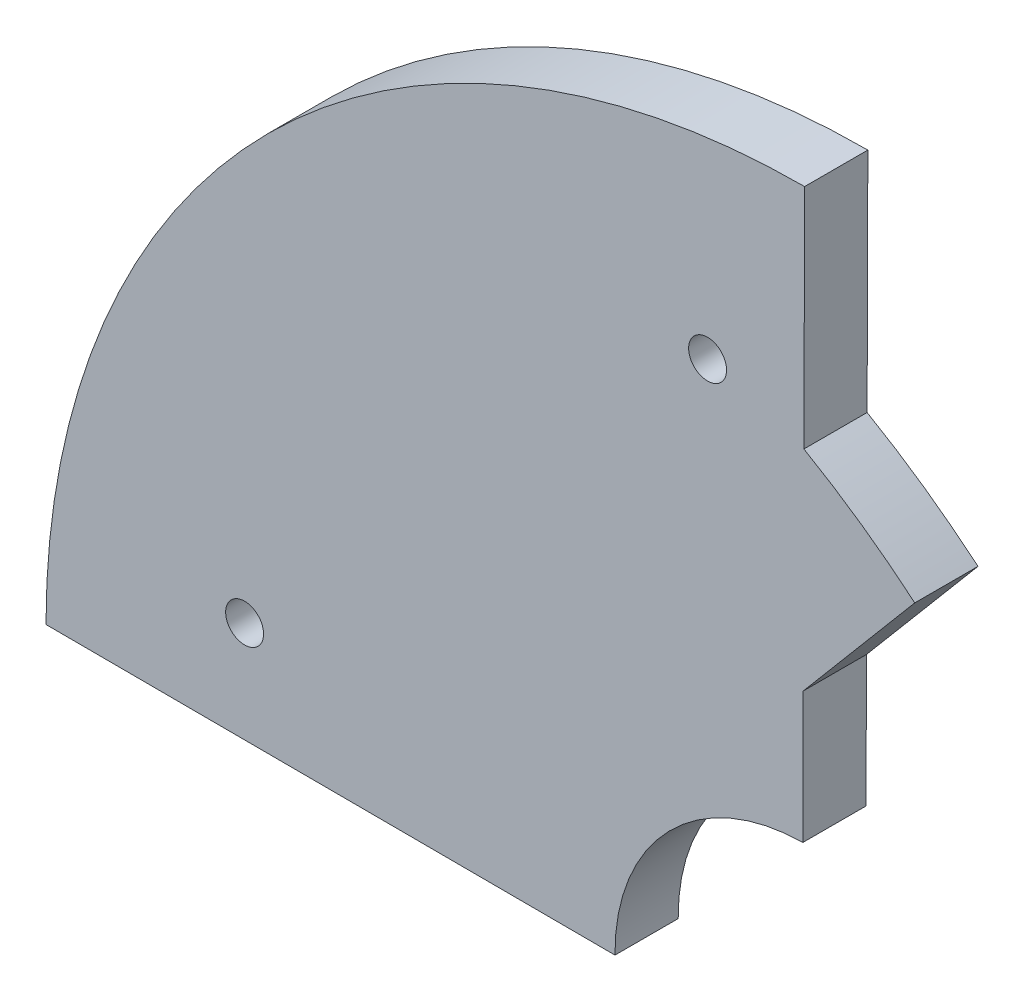
ISO-10303-21;
HEADER;
FILE_DESCRIPTION(('STEP AP214'),'2;1');
FILE_NAME('part.step','',(''),(''),'','','');
FILE_SCHEMA(('AUTOMOTIVE_DESIGN { 1 0 10303 214 1 1 1 1 }'));
ENDSEC;
DATA;
#1=APPLICATION_CONTEXT('core data for automotive mechanical design processes');
#2=APPLICATION_PROTOCOL_DEFINITION('international standard','automotive_design',2000,#1);
#3=PRODUCT_CONTEXT('',#1,'mechanical');
#4=PRODUCT('Part','Part','',(#3));
#5=PRODUCT_RELATED_PRODUCT_CATEGORY('part','',(#4));
#6=PRODUCT_DEFINITION_FORMATION('','',#4);
#7=PRODUCT_DEFINITION_CONTEXT('part definition',#1,'design');
#8=PRODUCT_DEFINITION('design','',#6,#7);
#9=PRODUCT_DEFINITION_SHAPE('','',#8);
#10=(LENGTH_UNIT() NAMED_UNIT(*) SI_UNIT(.MILLI.,.METRE.));
#11=(NAMED_UNIT(*) PLANE_ANGLE_UNIT() SI_UNIT($,.RADIAN.));
#12=(NAMED_UNIT(*) SI_UNIT($,.STERADIAN.) SOLID_ANGLE_UNIT());
#13=UNCERTAINTY_MEASURE_WITH_UNIT(LENGTH_MEASURE(1.E-05),#10,'distance_accuracy_value','');
#14=(GEOMETRIC_REPRESENTATION_CONTEXT(3) GLOBAL_UNCERTAINTY_ASSIGNED_CONTEXT((#13)) GLOBAL_UNIT_ASSIGNED_CONTEXT((#10,
#11,#12)) REPRESENTATION_CONTEXT('',''));
#15=CARTESIAN_POINT('',(0.,0.,0.));
#16=DIRECTION('',(0.,0.,1.));
#17=DIRECTION('',(1.,0.,0.));
#18=AXIS2_PLACEMENT_3D('',#15,#16,#17);
#19=CARTESIAN_POINT('',(-0.142376230836476,14.9993242850768,5.));
#20=DIRECTION('',(-0.999994995004897,0.00316385289736712,0.));
#21=DIRECTION('',(-0.00316385289736712,-0.999994995004897,0.));
#22=AXIS2_PLACEMENT_3D('',#19,#20,#21);
#23=PLANE('',#22);
#24=DIRECTION('',(0.,0.,1.));
#25=VECTOR('',#24,1.);
#26=CARTESIAN_POINT('',(-0.0569674409590416,41.9943727836793,0.));
#27=LINE('',#26,#25);
#28=CARTESIAN_POINT('',(-0.0569674409590416,41.9943727836793,0.));
#29=VERTEX_POINT('',#28);
#30=CARTESIAN_POINT('',(-0.0569674409590287,41.9943727836793,5.));
#31=VERTEX_POINT('',#30);
#32=EDGE_CURVE('E116',#29,#31,#27,.T.);
#33=ORIENTED_EDGE('',*,*,#32,.F.);
#34=DIRECTION('',(0.00316385289736712,0.999994995004897,0.));
#35=VECTOR('',#34,1.);
#36=CARTESIAN_POINT('',(-0.142376230836476,14.9993242850768,0.));
#37=LINE('',#36,#35);
#38=CARTESIAN_POINT('',(0.,60.,0.));
#39=VERTEX_POINT('',#38);
#40=EDGE_CURVE('E105',#29,#39,#37,.T.);
#41=ORIENTED_EDGE('',*,*,#40,.T.);
#42=DIRECTION('',(0.,0.,-1.));
#43=VECTOR('',#42,1.);
#44=CARTESIAN_POINT('',(0.,60.,5.));
#45=LINE('',#44,#43);
#46=CARTESIAN_POINT('',(0.,60.,5.));
#47=VERTEX_POINT('',#46);
#48=EDGE_CURVE('E149',#47,#39,#45,.T.);
#49=ORIENTED_EDGE('',*,*,#48,.F.);
#50=DIRECTION('',(0.00316385289736712,0.999994995004897,0.));
#51=VECTOR('',#50,1.);
#52=CARTESIAN_POINT('',(-0.142376230836476,14.9993242850768,5.));
#53=LINE('',#52,#51);
#54=EDGE_CURVE('E52',#31,#47,#53,.T.);
#55=ORIENTED_EDGE('',*,*,#54,.F.);
#56=EDGE_LOOP('',(#33,#41,#49,#55));
#57=FACE_BOUND('',#56,.T.);
#58=ADVANCED_FACE('F37',(#57),#23,.F.);
#59=DIRECTION('',(0.,0.,1.));
#60=VECTOR('',#59,1.);
#61=CARTESIAN_POINT('',(-0.109488526589845,25.3940994881836,0.));
#62=LINE('',#61,#60);
#63=CARTESIAN_POINT('',(-0.109488526589846,25.3940994881836,0.));
#64=VERTEX_POINT('',#63);
#65=CARTESIAN_POINT('',(-0.109488526589846,25.3940994881836,5.));
#66=VERTEX_POINT('',#65);
#67=EDGE_CURVE('E60',#64,#66,#62,.T.);
#68=ORIENTED_EDGE('',*,*,#67,.T.);
#69=CARTESIAN_POINT('',(-0.142376230836476,14.9993242850768,5.));
#70=VERTEX_POINT('',#69);
#71=EDGE_CURVE('E147',#70,#66,#53,.T.);
#72=ORIENTED_EDGE('',*,*,#71,.F.);
#73=DIRECTION('',(0.,0.,-1.));
#74=VECTOR('',#73,1.);
#75=CARTESIAN_POINT('',(-0.142376230836476,14.9993242850768,5.));
#76=LINE('',#75,#74);
#77=CARTESIAN_POINT('',(-0.142376230836476,14.9993242850768,0.));
#78=VERTEX_POINT('',#77);
#79=EDGE_CURVE('E159',#70,#78,#76,.T.);
#80=ORIENTED_EDGE('',*,*,#79,.T.);
#81=EDGE_CURVE('E143',#78,#64,#37,.T.);
#82=ORIENTED_EDGE('',*,*,#81,.T.);
#83=EDGE_LOOP('',(#68,#72,#80,#82));
#84=FACE_BOUND('',#83,.T.);
#85=ADVANCED_FACE('F169',(#84),#23,.F.);
#86=CARTESIAN_POINT('',(0.,0.,5.));
#87=DIRECTION('',(0.,0.,-1.));
#88=DIRECTION('',(-1.,0.,0.));
#89=AXIS2_PLACEMENT_3D('',#86,#87,#88);
#90=CYLINDRICAL_SURFACE('',#89,60.);
#91=CARTESIAN_POINT('',(0.,0.,0.));
#92=DIRECTION('',(0.,0.,1.));
#93=DIRECTION('',(1.,0.,0.));
#94=AXIS2_PLACEMENT_3D('',#91,#92,#93);
#95=CIRCLE('',#94,60.);
#96=CARTESIAN_POINT('',(-60.,0.,0.));
#97=VERTEX_POINT('',#96);
#98=EDGE_CURVE('E136',#39,#97,#95,.T.);
#99=ORIENTED_EDGE('',*,*,#98,.T.);
#100=DIRECTION('',(0.,0.,-1.));
#101=VECTOR('',#100,1.);
#102=CARTESIAN_POINT('',(-60.,0.,5.));
#103=LINE('',#102,#101);
#104=CARTESIAN_POINT('',(-60.,0.,5.));
#105=VERTEX_POINT('',#104);
#106=EDGE_CURVE('E11',#105,#97,#103,.T.);
#107=ORIENTED_EDGE('',*,*,#106,.F.);
#108=CARTESIAN_POINT('',(0.,0.,5.));
#109=DIRECTION('',(0.,0.,1.));
#110=DIRECTION('',(1.,0.,0.));
#111=AXIS2_PLACEMENT_3D('',#108,#109,#110);
#112=CIRCLE('',#111,60.);
#113=EDGE_CURVE('E139',#47,#105,#112,.T.);
#114=ORIENTED_EDGE('',*,*,#113,.F.);
#115=ORIENTED_EDGE('',*,*,#48,.T.);
#116=EDGE_LOOP('',(#99,#107,#114,#115));
#117=FACE_BOUND('',#116,.T.);
#118=ADVANCED_FACE('F39',(#117),#90,.T.);
#119=CARTESIAN_POINT('',(-60.,0.,5.));
#120=DIRECTION('',(0.0031638528973673,0.999994995004897,0.));
#121=DIRECTION('',(-0.999994995004897,0.0031638528973673,0.));
#122=AXIS2_PLACEMENT_3D('',#119,#120,#121);
#123=PLANE('',#122);
#124=DIRECTION('',(0.999994995004897,-0.0031638528973673,0.));
#125=VECTOR('',#124,1.);
#126=CARTESIAN_POINT('',(-60.,0.,0.));
#127=LINE('',#126,#125);
#128=CARTESIAN_POINT('',(-14.9993242850768,-0.142376230836485,0.));
#129=VERTEX_POINT('',#128);
#130=EDGE_CURVE('E152',#97,#129,#127,.T.);
#131=ORIENTED_EDGE('',*,*,#130,.T.);
#132=DIRECTION('',(0.,0.,-1.));
#133=VECTOR('',#132,1.);
#134=CARTESIAN_POINT('',(-14.9993242850768,-0.142376230836485,5.));
#135=LINE('',#134,#133);
#136=CARTESIAN_POINT('',(-14.9993242850768,-0.142376230836485,5.));
#137=VERTEX_POINT('',#136);
#138=EDGE_CURVE('E45',#137,#129,#135,.T.);
#139=ORIENTED_EDGE('',*,*,#138,.F.);
#140=DIRECTION('',(0.999994995004897,-0.0031638528973673,0.));
#141=VECTOR('',#140,1.);
#142=CARTESIAN_POINT('',(-60.,0.,5.));
#143=LINE('',#142,#141);
#144=EDGE_CURVE('E142',#105,#137,#143,.T.);
#145=ORIENTED_EDGE('',*,*,#144,.F.);
#146=ORIENTED_EDGE('',*,*,#106,.T.);
#147=EDGE_LOOP('',(#131,#139,#145,#146));
#148=FACE_BOUND('',#147,.T.);
#149=ADVANCED_FACE('F174',(#148),#123,.F.);
#150=CARTESIAN_POINT('',(0.,0.,5.));
#151=DIRECTION('',(0.,0.,-1.));
#152=DIRECTION('',(-1.,0.,0.));
#153=AXIS2_PLACEMENT_3D('',#150,#151,#152);
#154=CYLINDRICAL_SURFACE('',#153,15.);
#155=CARTESIAN_POINT('',(0.,0.,0.));
#156=DIRECTION('',(0.,0.,-1.));
#157=DIRECTION('',(-1.,0.,0.));
#158=AXIS2_PLACEMENT_3D('',#155,#156,#157);
#159=CIRCLE('',#158,15.);
#160=EDGE_CURVE('E154',#129,#78,#159,.T.);
#161=ORIENTED_EDGE('',*,*,#160,.T.);
#162=ORIENTED_EDGE('',*,*,#79,.F.);
#163=CARTESIAN_POINT('',(0.,0.,5.));
#164=DIRECTION('',(0.,0.,-1.));
#165=DIRECTION('',(-1.,0.,0.));
#166=AXIS2_PLACEMENT_3D('',#163,#164,#165);
#167=CIRCLE('',#166,15.);
#168=EDGE_CURVE('E145',#137,#70,#167,.T.);
#169=ORIENTED_EDGE('',*,*,#168,.F.);
#170=ORIENTED_EDGE('',*,*,#138,.T.);
#171=EDGE_LOOP('',(#161,#162,#169,#170));
#172=FACE_BOUND('',#171,.T.);
#173=ADVANCED_FACE('F166',(#172),#154,.F.);
#174=CARTESIAN_POINT('',(0.,0.,5.));
#175=DIRECTION('',(0.,0.,1.));
#176=DIRECTION('',(1.,0.,0.));
#177=AXIS2_PLACEMENT_3D('',#174,#175,#176);
#178=PLANE('',#177);
#179=CARTESIAN_POINT('',(-44.2914042043887,7.95433929396126,5.));
#180=DIRECTION('',(0.,0.,1.));
#181=DIRECTION('',(1.,0.,0.));
#182=AXIS2_PLACEMENT_3D('',#179,#180,#181);
#183=CIRCLE('',#182,1.5);
#184=CARTESIAN_POINT('',(-42.7914042043887,7.95433929396126,5.));
#185=VERTEX_POINT('',#184);
#186=EDGE_CURVE('E124',#185,#185,#183,.T.);
#187=ORIENTED_EDGE('',*,*,#186,.F.);
#188=EDGE_LOOP('',(#187));
#189=FACE_BOUND('',#188,.T.);
#190=CARTESIAN_POINT('',(-7.67391847631671,44.3408499604918,5.));
#191=DIRECTION('',(0.,0.,1.));
#192=DIRECTION('',(1.,0.,0.));
#193=AXIS2_PLACEMENT_3D('',#190,#191,#192);
#194=CIRCLE('',#193,1.5);
#195=CARTESIAN_POINT('',(-6.17391847631671,44.3408499604918,5.));
#196=VERTEX_POINT('',#195);
#197=EDGE_CURVE('E130',#196,#196,#194,.T.);
#198=ORIENTED_EDGE('',*,*,#197,.F.);
#199=EDGE_LOOP('',(#198));
#200=FACE_BOUND('',#199,.T.);
#201=ORIENTED_EDGE('',*,*,#113,.T.);
#202=ORIENTED_EDGE('',*,*,#144,.T.);
#203=ORIENTED_EDGE('',*,*,#168,.T.);
#204=ORIENTED_EDGE('',*,*,#71,.T.);
#205=DIRECTION('',(-0.645208044468575,-0.764006923628992,0.));
#206=VECTOR('',#205,1.);
#207=CARTESIAN_POINT('',(8.71248266811453,35.8404154177395,5.));
#208=LINE('',#207,#206);
#209=CARTESIAN_POINT('',(8.71248266811454,35.8404154177395,5.));
#210=VERTEX_POINT('',#209);
#211=EDGE_CURVE('E120',#210,#66,#208,.T.);
#212=ORIENTED_EDGE('',*,*,#211,.F.);
#213=CARTESIAN_POINT('',(-30.,-10.,5.));
#214=DIRECTION('',(0.,0.,-1.));
#215=DIRECTION('',(-1.,0.,0.));
#216=AXIS2_PLACEMENT_3D('',#213,#214,#215);
#217=CIRCLE('',#216,60.);
#218=EDGE_CURVE('E112',#31,#210,#217,.T.);
#219=ORIENTED_EDGE('',*,*,#218,.F.);
#220=ORIENTED_EDGE('',*,*,#54,.T.);
#221=EDGE_LOOP('',(#201,#202,#203,#204,#212,#219,#220));
#222=FACE_BOUND('',#221,.T.);
#223=ADVANCED_FACE('F171',(#189,#200,#222),#178,.T.);
#224=CARTESIAN_POINT('',(0.,0.,0.));
#225=DIRECTION('',(0.,0.,1.));
#226=DIRECTION('',(1.,0.,0.));
#227=AXIS2_PLACEMENT_3D('',#224,#225,#226);
#228=PLANE('',#227);
#229=CARTESIAN_POINT('',(-44.2914042043887,7.95433929396126,0.));
#230=DIRECTION('',(0.,0.,1.));
#231=DIRECTION('',(1.,0.,0.));
#232=AXIS2_PLACEMENT_3D('',#229,#230,#231);
#233=CIRCLE('',#232,1.5);
#234=CARTESIAN_POINT('',(-42.7914042043887,7.95433929396126,0.));
#235=VERTEX_POINT('',#234);
#236=EDGE_CURVE('E127',#235,#235,#233,.T.);
#237=ORIENTED_EDGE('',*,*,#236,.T.);
#238=EDGE_LOOP('',(#237));
#239=FACE_BOUND('',#238,.T.);
#240=CARTESIAN_POINT('',(-7.67391847631671,44.3408499604918,0.));
#241=DIRECTION('',(0.,0.,1.));
#242=DIRECTION('',(1.,0.,0.));
#243=AXIS2_PLACEMENT_3D('',#240,#241,#242);
#244=CIRCLE('',#243,1.5);
#245=CARTESIAN_POINT('',(-6.17391847631671,44.3408499604918,0.));
#246=VERTEX_POINT('',#245);
#247=EDGE_CURVE('E133',#246,#246,#244,.T.);
#248=ORIENTED_EDGE('',*,*,#247,.T.);
#249=EDGE_LOOP('',(#248));
#250=FACE_BOUND('',#249,.T.);
#251=ORIENTED_EDGE('',*,*,#98,.F.);
#252=ORIENTED_EDGE('',*,*,#40,.F.);
#253=CARTESIAN_POINT('',(-30.,-10.,0.));
#254=DIRECTION('',(0.,0.,-1.));
#255=DIRECTION('',(-1.,0.,0.));
#256=AXIS2_PLACEMENT_3D('',#253,#254,#255);
#257=CIRCLE('',#256,60.);
#258=CARTESIAN_POINT('',(8.71248266811454,35.8404154177395,0.));
#259=VERTEX_POINT('',#258);
#260=EDGE_CURVE('E98',#29,#259,#257,.T.);
#261=ORIENTED_EDGE('',*,*,#260,.T.);
#262=DIRECTION('',(-0.645208044468575,-0.764006923628992,0.));
#263=VECTOR('',#262,1.);
#264=CARTESIAN_POINT('',(8.71248266811453,35.8404154177395,0.));
#265=LINE('',#264,#263);
#266=EDGE_CURVE('E104',#259,#64,#265,.T.);
#267=ORIENTED_EDGE('',*,*,#266,.T.);
#268=ORIENTED_EDGE('',*,*,#81,.F.);
#269=ORIENTED_EDGE('',*,*,#160,.F.);
#270=ORIENTED_EDGE('',*,*,#130,.F.);
#271=EDGE_LOOP('',(#251,#252,#261,#267,#268,#269,#270));
#272=FACE_BOUND('',#271,.T.);
#273=ADVANCED_FACE('F101',(#239,#250,#272),#228,.F.);
#274=CARTESIAN_POINT('',(-7.67391847631671,44.3408499604918,0.));
#275=DIRECTION('',(0.,0.,1.));
#276=DIRECTION('',(1.,0.,0.));
#277=AXIS2_PLACEMENT_3D('',#274,#275,#276);
#278=CYLINDRICAL_SURFACE('',#277,1.5);
#279=ORIENTED_EDGE('',*,*,#247,.F.);
#280=EDGE_LOOP('',(#279));
#281=FACE_BOUND('',#280,.T.);
#282=ORIENTED_EDGE('',*,*,#197,.T.);
#283=EDGE_LOOP('',(#282));
#284=FACE_BOUND('',#283,.T.);
#285=ADVANCED_FACE('F217',(#281,#284),#278,.F.);
#286=CARTESIAN_POINT('',(-44.2914042043887,7.95433929396126,0.));
#287=DIRECTION('',(0.,0.,1.));
#288=DIRECTION('',(1.,0.,0.));
#289=AXIS2_PLACEMENT_3D('',#286,#287,#288);
#290=CYLINDRICAL_SURFACE('',#289,1.5);
#291=ORIENTED_EDGE('',*,*,#236,.F.);
#292=EDGE_LOOP('',(#291));
#293=FACE_BOUND('',#292,.T.);
#294=ORIENTED_EDGE('',*,*,#186,.T.);
#295=EDGE_LOOP('',(#294));
#296=FACE_BOUND('',#295,.T.);
#297=ADVANCED_FACE('F228',(#293,#296),#290,.F.);
#298=CARTESIAN_POINT('',(-30.,-10.,0.));
#299=DIRECTION('',(0.,0.,1.));
#300=DIRECTION('',(1.,0.,0.));
#301=AXIS2_PLACEMENT_3D('',#298,#299,#300);
#302=CYLINDRICAL_SURFACE('',#301,60.);
#303=ORIENTED_EDGE('',*,*,#218,.T.);
#304=DIRECTION('',(0.,0.,1.));
#305=VECTOR('',#304,1.);
#306=CARTESIAN_POINT('',(8.71248266811454,35.8404154177395,0.));
#307=LINE('',#306,#305);
#308=EDGE_CURVE('E109',#259,#210,#307,.T.);
#309=ORIENTED_EDGE('',*,*,#308,.F.);
#310=ORIENTED_EDGE('',*,*,#260,.F.);
#311=ORIENTED_EDGE('',*,*,#32,.T.);
#312=EDGE_LOOP('',(#303,#309,#310,#311));
#313=FACE_BOUND('',#312,.T.);
#314=ADVANCED_FACE('F110',(#313),#302,.T.);
#315=CARTESIAN_POINT('',(8.71248266811453,35.8404154177395,0.));
#316=DIRECTION('',(-0.764006923628993,0.645208044468575,0.));
#317=DIRECTION('',(-0.645208044468575,-0.764006923628993,0.));
#318=AXIS2_PLACEMENT_3D('',#315,#316,#317);
#319=PLANE('',#318);
#320=ORIENTED_EDGE('',*,*,#211,.T.);
#321=ORIENTED_EDGE('',*,*,#67,.F.);
#322=ORIENTED_EDGE('',*,*,#266,.F.);
#323=ORIENTED_EDGE('',*,*,#308,.T.);
#324=EDGE_LOOP('',(#320,#321,#322,#323));
#325=FACE_BOUND('',#324,.T.);
#326=ADVANCED_FACE('F118',(#325),#319,.F.);
#327=CLOSED_SHELL('',(#58,#85,#118,#149,#173,#223,#273,#285,#297,#314,#326));
#328=MANIFOLD_SOLID_BREP('B2',#327);
#329=ADVANCED_BREP_SHAPE_REPRESENTATION('',(#18,#328),#14);
#330=SHAPE_DEFINITION_REPRESENTATION(#9,#329);
ENDSEC;
END-ISO-10303-21;
